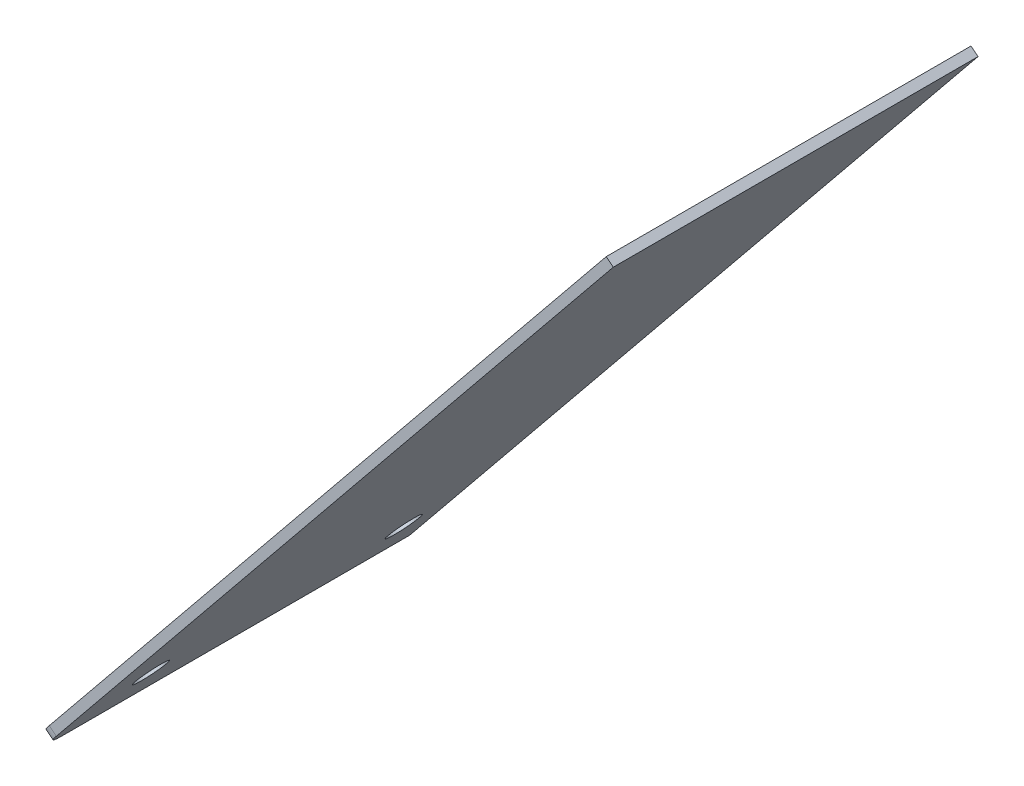
ISO-10303-21;
HEADER;
FILE_DESCRIPTION(('STEP AP214'),'2;1');
FILE_NAME('part.step','',(''),(''),'','','');
FILE_SCHEMA(('AUTOMOTIVE_DESIGN { 1 0 10303 214 1 1 1 1 }'));
ENDSEC;
DATA;
#1=APPLICATION_CONTEXT('core data for automotive mechanical design processes');
#2=APPLICATION_PROTOCOL_DEFINITION('international standard','automotive_design',2000,#1);
#3=PRODUCT_CONTEXT('',#1,'mechanical');
#4=PRODUCT('Part','Part','',(#3));
#5=PRODUCT_RELATED_PRODUCT_CATEGORY('part','',(#4));
#6=PRODUCT_DEFINITION_FORMATION('','',#4);
#7=PRODUCT_DEFINITION_CONTEXT('part definition',#1,'design');
#8=PRODUCT_DEFINITION('design','',#6,#7);
#9=PRODUCT_DEFINITION_SHAPE('','',#8);
#10=(LENGTH_UNIT() NAMED_UNIT(*) SI_UNIT(.MILLI.,.METRE.));
#11=(NAMED_UNIT(*) PLANE_ANGLE_UNIT() SI_UNIT($,.RADIAN.));
#12=(NAMED_UNIT(*) SI_UNIT($,.STERADIAN.) SOLID_ANGLE_UNIT());
#13=UNCERTAINTY_MEASURE_WITH_UNIT(LENGTH_MEASURE(1.E-05),#10,'distance_accuracy_value','');
#14=(GEOMETRIC_REPRESENTATION_CONTEXT(3) GLOBAL_UNCERTAINTY_ASSIGNED_CONTEXT((#13)) GLOBAL_UNIT_ASSIGNED_CONTEXT((#10,
#11,#12)) REPRESENTATION_CONTEXT('',''));
#15=CARTESIAN_POINT('',(0.,0.,0.));
#16=DIRECTION('',(0.,0.,1.));
#17=DIRECTION('',(1.,0.,0.));
#18=AXIS2_PLACEMENT_3D('',#15,#16,#17);
#19=CARTESIAN_POINT('',(-117.475,-3.175,896.297358085569));
#20=DIRECTION('',(0.77574502790219,-0.631046473474839,0.));
#21=DIRECTION('',(0.631046473474839,0.77574502790219,0.));
#22=AXIS2_PLACEMENT_3D('',#19,#20,#21);
#23=PLANE('',#22);
#24=CARTESIAN_POINT('',(-485.210394982228,-455.231886825287,213.995));
#25=DIRECTION('',(-0.77574502790219,0.631046473474839,0.));
#26=DIRECTION('',(-0.631046473474839,-0.77574502790219,0.));
#27=AXIS2_PLACEMENT_3D('',#24,#25,#26);
#28=CIRCLE('',#27,11.1125000000001);
#29=CARTESIAN_POINT('',(-492.222898918717,-463.85235344785,213.995));
#30=VERTEX_POINT('',#29);
#31=EDGE_CURVE('E186',#30,#30,#28,.T.);
#32=ORIENTED_EDGE('',*,*,#31,.F.);
#33=EDGE_LOOP('',(#32));
#34=FACE_BOUND('',#33,.T.);
#35=CARTESIAN_POINT('',(-485.210394982228,-455.231886825287,36.195));
#36=DIRECTION('',(-0.77574502790219,0.631046473474839,0.));
#37=DIRECTION('',(-0.631046473474839,-0.77574502790219,0.));
#38=AXIS2_PLACEMENT_3D('',#35,#36,#37);
#39=CIRCLE('',#38,11.1125000000001);
#40=CARTESIAN_POINT('',(-492.222898918717,-463.85235344785,36.195));
#41=VERTEX_POINT('',#40);
#42=EDGE_CURVE('E130',#41,#41,#39,.T.);
#43=ORIENTED_EDGE('',*,*,#42,.F.);
#44=EDGE_LOOP('',(#43));
#45=FACE_BOUND('',#44,.T.);
#46=DIRECTION('',(0.,0.,-1.));
#47=VECTOR('',#46,1.);
#48=CARTESIAN_POINT('',(-517.26755583475,-494.639734242718,896.297358085569));
#49=LINE('',#48,#47);
#50=CARTESIAN_POINT('',(-517.26755583475,-494.639734242718,243.84));
#51=VERTEX_POINT('',#50);
#52=CARTESIAN_POINT('',(-517.26755583475,-494.639734242718,0.));
#53=VERTEX_POINT('',#52);
#54=EDGE_CURVE('E117',#51,#53,#49,.T.);
#55=ORIENTED_EDGE('',*,*,#54,.F.);
#56=CARTESIAN_POINT('',(-509.25326562162,-484.78777238836,243.84));
#57=DIRECTION('',(0.77574502790219,-0.631046473474839,0.));
#58=DIRECTION('',(0.631046473474839,0.77574502790219,0.));
#59=AXIS2_PLACEMENT_3D('',#56,#57,#58);
#60=CIRCLE('',#59,12.7);
#61=CARTESIAN_POINT('',(-509.25326562162,-484.78777238836,256.54));
#62=VERTEX_POINT('',#61);
#63=EDGE_CURVE('E13',#51,#62,#60,.F.);
#64=ORIENTED_EDGE('',*,*,#63,.T.);
#65=DIRECTION('',(-0.631046473474839,-0.77574502790219,0.));
#66=VECTOR('',#65,1.);
#67=CARTESIAN_POINT('',(-117.475,-3.175,256.54));
#68=LINE('',#67,#66);
#69=CARTESIAN_POINT('',(-117.475,-3.175,256.54));
#70=VERTEX_POINT('',#69);
#71=EDGE_CURVE('E98',#70,#62,#68,.T.);
#72=ORIENTED_EDGE('',*,*,#71,.F.);
#73=DIRECTION('',(0.,0.,-1.));
#74=VECTOR('',#73,1.);
#75=CARTESIAN_POINT('',(-117.475,-3.175,896.297358085569));
#76=LINE('',#75,#74);
#77=CARTESIAN_POINT('',(-117.475,-3.175,0.));
#78=VERTEX_POINT('',#77);
#79=EDGE_CURVE('E111',#70,#78,#76,.T.);
#80=ORIENTED_EDGE('',*,*,#79,.T.);
#81=DIRECTION('',(-0.631046473474839,-0.77574502790219,0.));
#82=VECTOR('',#81,1.);
#83=CARTESIAN_POINT('',(-117.475,-3.175,0.));
#84=LINE('',#83,#82);
#85=EDGE_CURVE('E120',#78,#53,#84,.T.);
#86=ORIENTED_EDGE('',*,*,#85,.T.);
#87=EDGE_LOOP('',(#55,#64,#72,#80,#86));
#88=FACE_BOUND('',#87,.T.);
#89=ADVANCED_FACE('F45',(#34,#45,#88),#23,.F.);
#90=CARTESIAN_POINT('',(-517.26755583475,-494.639734242718,896.297358085569));
#91=DIRECTION('',(0.631046473474837,0.775745027902191,0.));
#92=DIRECTION('',(-0.775745027902191,0.631046473474837,0.));
#93=AXIS2_PLACEMENT_3D('',#90,#91,#92);
#94=PLANE('',#93);
#95=DIRECTION('',(0.,0.,-1.));
#96=VECTOR('',#95,1.);
#97=CARTESIAN_POINT('',(-512.341574907571,-498.646879349283,896.297358085569));
#98=LINE('',#97,#96);
#99=CARTESIAN_POINT('',(-512.341574907571,-498.646879349283,243.84));
#100=VERTEX_POINT('',#99);
#101=CARTESIAN_POINT('',(-512.341574907571,-498.646879349283,0.));
#102=VERTEX_POINT('',#101);
#103=EDGE_CURVE('E121',#100,#102,#98,.T.);
#104=ORIENTED_EDGE('',*,*,#103,.F.);
#105=DIRECTION('',(0.775745027902191,-0.631046473474837,0.));
#106=VECTOR('',#105,1.);
#107=CARTESIAN_POINT('',(-517.26755583475,-494.639734242718,243.84));
#108=LINE('',#107,#106);
#109=EDGE_CURVE('E53',#100,#51,#108,.F.);
#110=ORIENTED_EDGE('',*,*,#109,.T.);
#111=ORIENTED_EDGE('',*,*,#54,.T.);
#112=DIRECTION('',(0.775745027902191,-0.631046473474837,0.));
#113=VECTOR('',#112,1.);
#114=CARTESIAN_POINT('',(-517.26755583475,-494.639734242718,0.));
#115=LINE('',#114,#113);
#116=EDGE_CURVE('E119',#53,#102,#115,.T.);
#117=ORIENTED_EDGE('',*,*,#116,.T.);
#118=EDGE_LOOP('',(#104,#110,#111,#117));
#119=FACE_BOUND('',#118,.T.);
#120=ADVANCED_FACE('F142',(#119),#94,.F.);
#121=CARTESIAN_POINT('',(-512.341574907571,-498.646879349283,896.297358085569));
#122=DIRECTION('',(-0.77574502790219,0.631046473474838,0.));
#123=DIRECTION('',(-0.631046473474838,-0.77574502790219,0.));
#124=AXIS2_PLACEMENT_3D('',#121,#122,#123);
#125=PLANE('',#124);
#126=CARTESIAN_POINT('',(-480.284414055049,-459.239031931852,213.995));
#127=DIRECTION('',(-0.77574502790219,0.631046473474838,0.));
#128=DIRECTION('',(-0.631046473474838,-0.77574502790219,0.));
#129=AXIS2_PLACEMENT_3D('',#126,#127,#128);
#130=CIRCLE('',#129,11.1125000000001);
#131=CARTESIAN_POINT('',(-487.296917991538,-467.859498554415,213.995));
#132=VERTEX_POINT('',#131);
#133=EDGE_CURVE('E135',#132,#132,#130,.F.);
#134=ORIENTED_EDGE('',*,*,#133,.F.);
#135=EDGE_LOOP('',(#134));
#136=FACE_BOUND('',#135,.T.);
#137=CARTESIAN_POINT('',(-480.284414055049,-459.239031931852,36.195));
#138=DIRECTION('',(-0.77574502790219,0.631046473474838,0.));
#139=DIRECTION('',(-0.631046473474838,-0.77574502790219,0.));
#140=AXIS2_PLACEMENT_3D('',#137,#138,#139);
#141=CIRCLE('',#140,11.1125000000001);
#142=CARTESIAN_POINT('',(-487.296917991538,-467.859498554415,36.195));
#143=VERTEX_POINT('',#142);
#144=EDGE_CURVE('E124',#143,#143,#141,.F.);
#145=ORIENTED_EDGE('',*,*,#144,.F.);
#146=EDGE_LOOP('',(#145));
#147=FACE_BOUND('',#146,.T.);
#148=DIRECTION('',(0.631046473474838,0.77574502790219,0.));
#149=VECTOR('',#148,1.);
#150=CARTESIAN_POINT('',(-512.341574907571,-498.646879349283,256.54));
#151=LINE('',#150,#149);
#152=CARTESIAN_POINT('',(-504.327284694441,-488.794917494926,256.54));
#153=VERTEX_POINT('',#152);
#154=CARTESIAN_POINT('',(-112.549019072821,-7.1821451065651,256.54));
#155=VERTEX_POINT('',#154);
#156=EDGE_CURVE('E90',#153,#155,#151,.T.);
#157=ORIENTED_EDGE('',*,*,#156,.F.);
#158=CARTESIAN_POINT('',(-504.327284694441,-488.794917494926,243.84));
#159=DIRECTION('',(-0.77574502790219,0.631046473474838,0.));
#160=DIRECTION('',(-0.631046473474838,-0.77574502790219,0.));
#161=AXIS2_PLACEMENT_3D('',#158,#159,#160);
#162=CIRCLE('',#161,12.7);
#163=EDGE_CURVE('E67',#153,#100,#162,.F.);
#164=ORIENTED_EDGE('',*,*,#163,.T.);
#165=ORIENTED_EDGE('',*,*,#103,.T.);
#166=DIRECTION('',(0.631046473474839,0.77574502790219,0.));
#167=VECTOR('',#166,1.);
#168=CARTESIAN_POINT('',(-512.341574907571,-498.646879349283,0.));
#169=LINE('',#168,#167);
#170=CARTESIAN_POINT('',(-112.549019072821,-7.1821451065651,0.));
#171=VERTEX_POINT('',#170);
#172=EDGE_CURVE('E104',#102,#171,#169,.T.);
#173=ORIENTED_EDGE('',*,*,#172,.T.);
#174=DIRECTION('',(0.,0.,-1.));
#175=VECTOR('',#174,1.);
#176=CARTESIAN_POINT('',(-112.549019072821,-7.1821451065651,896.297358085569));
#177=LINE('',#176,#175);
#178=EDGE_CURVE('E101',#155,#171,#177,.T.);
#179=ORIENTED_EDGE('',*,*,#178,.F.);
#180=EDGE_LOOP('',(#157,#164,#165,#173,#179));
#181=FACE_BOUND('',#180,.T.);
#182=ADVANCED_FACE('F102',(#136,#147,#181),#125,.F.);
#183=CARTESIAN_POINT('',(-112.549019072821,-7.1821451065651,896.297358085569));
#184=DIRECTION('',(-0.631046473474839,-0.77574502790219,0.));
#185=DIRECTION('',(0.77574502790219,-0.631046473474839,0.));
#186=AXIS2_PLACEMENT_3D('',#183,#184,#185);
#187=PLANE('',#186);
#188=DIRECTION('',(-0.77574502790219,0.631046473474839,0.));
#189=VECTOR('',#188,1.);
#190=CARTESIAN_POINT('',(-112.549019072821,-7.1821451065651,256.54));
#191=LINE('',#190,#189);
#192=EDGE_CURVE('E95',#155,#70,#191,.T.);
#193=ORIENTED_EDGE('',*,*,#192,.F.);
#194=ORIENTED_EDGE('',*,*,#178,.T.);
#195=DIRECTION('',(-0.77574502790219,0.631046473474839,0.));
#196=VECTOR('',#195,1.);
#197=CARTESIAN_POINT('',(-112.549019072821,-7.1821451065651,0.));
#198=LINE('',#197,#196);
#199=EDGE_CURVE('E108',#171,#78,#198,.T.);
#200=ORIENTED_EDGE('',*,*,#199,.T.);
#201=ORIENTED_EDGE('',*,*,#79,.F.);
#202=EDGE_LOOP('',(#193,#194,#200,#201));
#203=FACE_BOUND('',#202,.T.);
#204=ADVANCED_FACE('F110',(#203),#187,.F.);
#205=CARTESIAN_POINT('',(-517.26755583475,-494.639734242718,0.));
#206=DIRECTION('',(0.,0.,1.));
#207=DIRECTION('',(1.,0.,0.));
#208=AXIS2_PLACEMENT_3D('',#205,#206,#207);
#209=PLANE('',#208);
#210=ORIENTED_EDGE('',*,*,#85,.F.);
#211=ORIENTED_EDGE('',*,*,#199,.F.);
#212=ORIENTED_EDGE('',*,*,#172,.F.);
#213=ORIENTED_EDGE('',*,*,#116,.F.);
#214=EDGE_LOOP('',(#210,#211,#212,#213));
#215=FACE_BOUND('',#214,.T.);
#216=ADVANCED_FACE('F145',(#215),#209,.F.);
#217=CARTESIAN_POINT('',(101.854,-3057.525,256.54));
#218=DIRECTION('',(0.,0.,1.));
#219=DIRECTION('',(0.,1.,0.));
#220=AXIS2_PLACEMENT_3D('',#217,#218,#219);
#221=PLANE('',#220);
#222=ORIENTED_EDGE('',*,*,#71,.T.);
#223=DIRECTION('',(0.775745027902191,-0.631046473474837,0.));
#224=VECTOR('',#223,1.);
#225=CARTESIAN_POINT('',(-504.327284694441,-488.794917494926,256.54));
#226=LINE('',#225,#224);
#227=EDGE_CURVE('E97',#62,#153,#226,.T.);
#228=ORIENTED_EDGE('',*,*,#227,.T.);
#229=ORIENTED_EDGE('',*,*,#156,.T.);
#230=ORIENTED_EDGE('',*,*,#192,.T.);
#231=EDGE_LOOP('',(#222,#228,#229,#230));
#232=FACE_BOUND('',#231,.T.);
#233=ADVANCED_FACE('F93',(#232),#221,.T.);
#234=CARTESIAN_POINT('',(-239.696019239569,-654.950834968279,36.195));
#235=DIRECTION('',(-0.77574502790219,0.631046473474839,0.));
#236=DIRECTION('',(-0.631046473474839,-0.77574502790219,0.));
#237=AXIS2_PLACEMENT_3D('',#234,#235,#236);
#238=CYLINDRICAL_SURFACE('',#237,11.1125000000001);
#239=ORIENTED_EDGE('',*,*,#42,.T.);
#240=EDGE_LOOP('',(#239));
#241=FACE_BOUND('',#240,.T.);
#242=ORIENTED_EDGE('',*,*,#144,.T.);
#243=EDGE_LOOP('',(#242));
#244=FACE_BOUND('',#243,.T.);
#245=ADVANCED_FACE('F153',(#241,#244),#238,.F.);
#246=CARTESIAN_POINT('',(-239.696019239569,-654.950834968279,213.995));
#247=DIRECTION('',(-0.77574502790219,0.631046473474839,0.));
#248=DIRECTION('',(-0.631046473474839,-0.77574502790219,0.));
#249=AXIS2_PLACEMENT_3D('',#246,#247,#248);
#250=CYLINDRICAL_SURFACE('',#249,11.1125000000001);
#251=ORIENTED_EDGE('',*,*,#31,.T.);
#252=EDGE_LOOP('',(#251));
#253=FACE_BOUND('',#252,.T.);
#254=ORIENTED_EDGE('',*,*,#133,.T.);
#255=EDGE_LOOP('',(#254));
#256=FACE_BOUND('',#255,.T.);
#257=ADVANCED_FACE('F149',(#253,#256),#250,.F.);
#258=CARTESIAN_POINT('',(1117.93412768673,-1808.4583462195,243.84));
#259=DIRECTION('',(-0.775745027902191,0.631046473474837,0.));
#260=DIRECTION('',(-0.631046473474837,-0.775745027902191,0.));
#261=AXIS2_PLACEMENT_3D('',#258,#259,#260);
#262=CYLINDRICAL_SURFACE('',#261,12.7);
#263=ORIENTED_EDGE('',*,*,#63,.F.);
#264=ORIENTED_EDGE('',*,*,#109,.F.);
#265=ORIENTED_EDGE('',*,*,#163,.F.);
#266=ORIENTED_EDGE('',*,*,#227,.F.);
#267=EDGE_LOOP('',(#263,#264,#265,#266));
#268=FACE_BOUND('',#267,.T.);
#269=ADVANCED_FACE('F47',(#268),#262,.T.);
#270=CLOSED_SHELL('',(#89,#120,#182,#204,#216,#233,#245,#257,#269));
#271=MANIFOLD_SOLID_BREP('B2',#270);
#272=ADVANCED_BREP_SHAPE_REPRESENTATION('',(#18,#271),#14);
#273=SHAPE_DEFINITION_REPRESENTATION(#9,#272);
ENDSEC;
END-ISO-10303-21;
